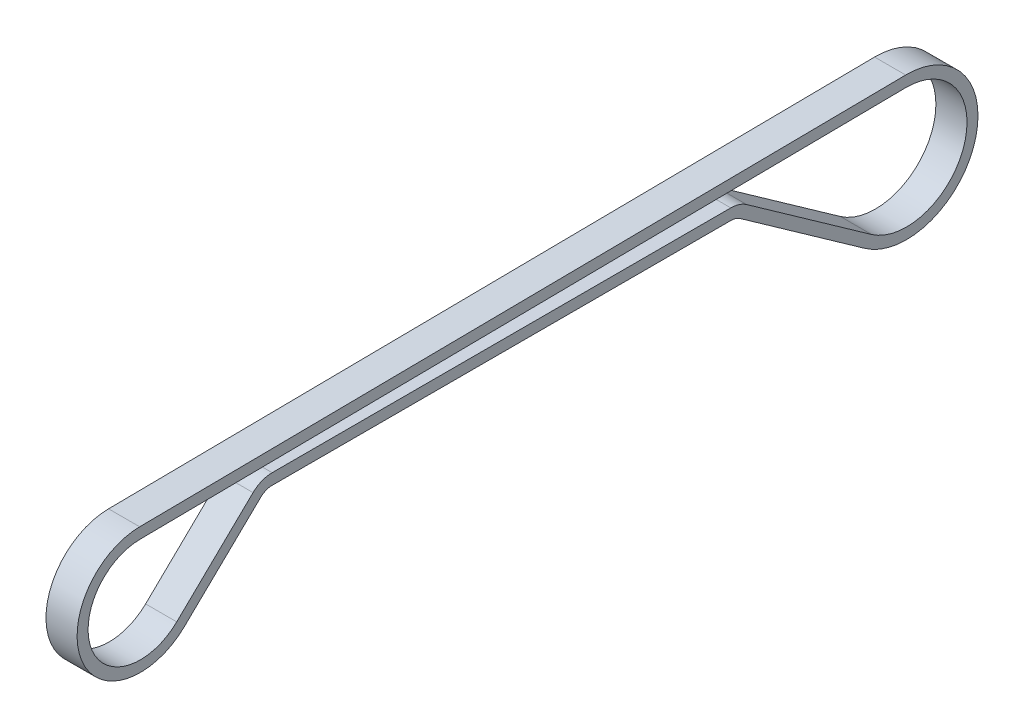
ISO-10303-21;
HEADER;
FILE_DESCRIPTION(('STEP AP214'),'2;1');
FILE_NAME('part.step','',(''),(''),'','','');
FILE_SCHEMA(('AUTOMOTIVE_DESIGN { 1 0 10303 214 1 1 1 1 }'));
ENDSEC;
DATA;
#1=APPLICATION_CONTEXT('core data for automotive mechanical design processes');
#2=APPLICATION_PROTOCOL_DEFINITION('international standard','automotive_design',2000,#1);
#3=PRODUCT_CONTEXT('',#1,'mechanical');
#4=PRODUCT('Part','Part','',(#3));
#5=PRODUCT_RELATED_PRODUCT_CATEGORY('part','',(#4));
#6=PRODUCT_DEFINITION_FORMATION('','',#4);
#7=PRODUCT_DEFINITION_CONTEXT('part definition',#1,'design');
#8=PRODUCT_DEFINITION('design','',#6,#7);
#9=PRODUCT_DEFINITION_SHAPE('','',#8);
#10=(LENGTH_UNIT() NAMED_UNIT(*) SI_UNIT(.MILLI.,.METRE.));
#11=(NAMED_UNIT(*) PLANE_ANGLE_UNIT() SI_UNIT($,.RADIAN.));
#12=(NAMED_UNIT(*) SI_UNIT($,.STERADIAN.) SOLID_ANGLE_UNIT());
#13=UNCERTAINTY_MEASURE_WITH_UNIT(LENGTH_MEASURE(1.E-05),#10,'distance_accuracy_value','');
#14=(GEOMETRIC_REPRESENTATION_CONTEXT(3) GLOBAL_UNCERTAINTY_ASSIGNED_CONTEXT((#13)) GLOBAL_UNIT_ASSIGNED_CONTEXT((#10,
#11,#12)) REPRESENTATION_CONTEXT('',''));
#15=CARTESIAN_POINT('',(0.,0.,0.));
#16=DIRECTION('',(0.,0.,1.));
#17=DIRECTION('',(1.,0.,0.));
#18=AXIS2_PLACEMENT_3D('',#15,#16,#17);
#19=CARTESIAN_POINT('',(15.7818,9.52500000000001,-221.533693244064));
#20=DIRECTION('',(0.,-1.,0.));
#21=DIRECTION('',(0.,0.,-1.));
#22=AXIS2_PLACEMENT_3D('',#19,#20,#21);
#23=PLANE('',#22);
#24=DIRECTION('',(0.,0.,1.));
#25=VECTOR('',#24,1.);
#26=CARTESIAN_POINT('',(6.78180000000002,9.52500000000001,-221.533693244064));
#27=LINE('',#26,#25);
#28=CARTESIAN_POINT('',(6.78180000000002,9.52500000000001,-170.733693244064));
#29=VERTEX_POINT('',#28);
#30=CARTESIAN_POINT('',(6.78180000000002,9.525,-38.1));
#31=VERTEX_POINT('',#30);
#32=EDGE_CURVE('E206',#29,#31,#27,.T.);
#33=ORIENTED_EDGE('',*,*,#32,.F.);
#34=DIRECTION('',(-1.,0.,0.));
#35=VECTOR('',#34,1.);
#36=CARTESIAN_POINT('',(15.7818,9.52500000000001,-170.733693244064));
#37=LINE('',#36,#35);
#38=CARTESIAN_POINT('',(15.7818,9.52500000000001,-170.733693244064));
#39=VERTEX_POINT('',#38);
#40=EDGE_CURVE('E11',#39,#29,#37,.T.);
#41=ORIENTED_EDGE('',*,*,#40,.F.);
#42=DIRECTION('',(0.,0.,1.));
#43=VECTOR('',#42,1.);
#44=CARTESIAN_POINT('',(15.7818,9.52500000000001,-221.533693244064));
#45=LINE('',#44,#43);
#46=CARTESIAN_POINT('',(15.7818,9.525,-38.1));
#47=VERTEX_POINT('',#46);
#48=EDGE_CURVE('E218',#39,#47,#45,.T.);
#49=ORIENTED_EDGE('',*,*,#48,.T.);
#50=DIRECTION('',(-1.,0.,0.));
#51=VECTOR('',#50,1.);
#52=CARTESIAN_POINT('',(15.7818,9.525,-38.1));
#53=LINE('',#52,#51);
#54=EDGE_CURVE('E40',#47,#31,#53,.T.);
#55=ORIENTED_EDGE('',*,*,#54,.T.);
#56=EDGE_LOOP('',(#33,#41,#49,#55));
#57=FACE_BOUND('',#56,.T.);
#58=ADVANCED_FACE('F37',(#57),#23,.T.);
#59=CARTESIAN_POINT('',(15.7818,4.7625,-170.733693244064));
#60=DIRECTION('',(-1.,0.,0.));
#61=DIRECTION('',(0.,0.,1.));
#62=AXIS2_PLACEMENT_3D('',#59,#60,#61);
#63=CYLINDRICAL_SURFACE('',#62,4.7625);
#64=CARTESIAN_POINT('',(6.78180000000002,4.7625,-170.733693244064));
#65=DIRECTION('',(1.,0.,0.));
#66=DIRECTION('',(0.,0.,-1.));
#67=AXIS2_PLACEMENT_3D('',#64,#65,#66);
#68=CIRCLE('',#67,4.7625);
#69=CARTESIAN_POINT('',(6.78180000000002,8.65054715658718,-173.484056048887));
#70=VERTEX_POINT('',#69);
#71=EDGE_CURVE('E222',#70,#29,#68,.T.);
#72=ORIENTED_EDGE('',*,*,#71,.F.);
#73=DIRECTION('',(-1.,0.,0.));
#74=VECTOR('',#73,1.);
#75=CARTESIAN_POINT('',(15.7818,8.65054715658718,-173.484056048887));
#76=LINE('',#75,#74);
#77=CARTESIAN_POINT('',(15.7818,8.65054715658718,-173.484056048887));
#78=VERTEX_POINT('',#77);
#79=EDGE_CURVE('E45',#78,#70,#76,.T.);
#80=ORIENTED_EDGE('',*,*,#79,.F.);
#81=CARTESIAN_POINT('',(15.7818,4.7625,-170.733693244064));
#82=DIRECTION('',(1.,0.,0.));
#83=DIRECTION('',(0.,0.,-1.));
#84=AXIS2_PLACEMENT_3D('',#81,#82,#83);
#85=CIRCLE('',#84,4.7625);
#86=EDGE_CURVE('E238',#78,#39,#85,.T.);
#87=ORIENTED_EDGE('',*,*,#86,.T.);
#88=ORIENTED_EDGE('',*,*,#40,.T.);
#89=EDGE_LOOP('',(#72,#80,#87,#88));
#90=FACE_BOUND('',#89,.T.);
#91=ADVANCED_FACE('F286',(#90),#63,.F.);
#92=CARTESIAN_POINT('',(15.7818,-16.8883347840239,-209.587066581708));
#93=DIRECTION('',(0.,-0.816387854401507,0.577504001012723));
#94=DIRECTION('',(0.,-0.577504001012723,-0.816387854401507));
#95=AXIS2_PLACEMENT_3D('',#92,#93,#94);
#96=PLANE('',#95);
#97=DIRECTION('',(0.,0.577504001012723,0.816387854401507));
#98=VECTOR('',#97,1.);
#99=CARTESIAN_POINT('',(6.78180000000002,-16.8883347840239,-209.587066581708));
#100=LINE('',#99,#98);
#101=CARTESIAN_POINT('',(6.78180000000002,-16.8883347840239,-209.587066581708));
#102=VERTEX_POINT('',#101);
#103=EDGE_CURVE('E258',#102,#70,#100,.T.);
#104=ORIENTED_EDGE('',*,*,#103,.F.);
#105=DIRECTION('',(-1.,0.,0.));
#106=VECTOR('',#105,1.);
#107=CARTESIAN_POINT('',(15.7818,-16.8883347840239,-209.587066581708));
#108=LINE('',#107,#106);
#109=CARTESIAN_POINT('',(15.7818,-16.8883347840239,-209.587066581708));
#110=VERTEX_POINT('',#109);
#111=EDGE_CURVE('E264',#110,#102,#108,.T.);
#112=ORIENTED_EDGE('',*,*,#111,.F.);
#113=DIRECTION('',(0.,0.577504001012723,0.816387854401507));
#114=VECTOR('',#113,1.);
#115=CARTESIAN_POINT('',(15.7818,-16.8883347840239,-209.587066581708));
#116=LINE('',#115,#114);
#117=EDGE_CURVE('E235',#110,#78,#116,.T.);
#118=ORIENTED_EDGE('',*,*,#117,.T.);
#119=ORIENTED_EDGE('',*,*,#79,.T.);
#120=EDGE_LOOP('',(#104,#112,#118,#119));
#121=FACE_BOUND('',#120,.T.);
#122=ADVANCED_FACE('F305',(#121),#96,.T.);
#123=CARTESIAN_POINT('',(15.7818,0.,-221.533693244064));
#124=DIRECTION('',(-1.,0.,0.));
#125=DIRECTION('',(0.,0.,1.));
#126=AXIS2_PLACEMENT_3D('',#123,#124,#125);
#127=CYLINDRICAL_SURFACE('',#126,20.6866560948592);
#128=CARTESIAN_POINT('',(6.78180000000002,0.,-221.533693244064));
#129=DIRECTION('',(1.,0.,0.));
#130=DIRECTION('',(0.,0.,-1.));
#131=AXIS2_PLACEMENT_3D('',#128,#129,#130);
#132=CIRCLE('',#131,20.6866560948592);
#133=CARTESIAN_POINT('',(6.78180000000002,20.68545482186,-221.310760070755));
#134=VERTEX_POINT('',#133);
#135=EDGE_CURVE('E255',#102,#134,#132,.T.);
#136=ORIENTED_EDGE('',*,*,#135,.T.);
#137=DIRECTION('',(-1.,0.,0.));
#138=VECTOR('',#137,1.);
#139=CARTESIAN_POINT('',(15.7818,20.68545482186,-221.310760070755));
#140=LINE('',#139,#138);
#141=CARTESIAN_POINT('',(15.7818,20.68545482186,-221.310760070755));
#142=VERTEX_POINT('',#141);
#143=EDGE_CURVE('E266',#142,#134,#140,.T.);
#144=ORIENTED_EDGE('',*,*,#143,.F.);
#145=CARTESIAN_POINT('',(15.7818,0.,-221.533693244064));
#146=DIRECTION('',(1.,0.,0.));
#147=DIRECTION('',(0.,0.,-1.));
#148=AXIS2_PLACEMENT_3D('',#145,#146,#147);
#149=CIRCLE('',#148,20.6866560948592);
#150=EDGE_CURVE('E233',#110,#142,#149,.T.);
#151=ORIENTED_EDGE('',*,*,#150,.F.);
#152=ORIENTED_EDGE('',*,*,#111,.T.);
#153=EDGE_LOOP('',(#136,#144,#151,#152));
#154=FACE_BOUND('',#153,.T.);
#155=ADVANCED_FACE('F303',(#154),#127,.T.);
#156=CARTESIAN_POINT('',(15.7818,20.68545482186,-221.310760070755));
#157=DIRECTION('',(0.,0.999941930054156,0.0107766655125783));
#158=DIRECTION('',(0.,-0.0107766655125783,0.999941930054156));
#159=AXIS2_PLACEMENT_3D('',#156,#157,#158);
#160=PLANE('',#159);
#161=DIRECTION('',(0.,0.0107766655125783,-0.999941930054156));
#162=VECTOR('',#161,1.);
#163=CARTESIAN_POINT('',(6.78180000000002,20.68545482186,-221.310760070755));
#164=LINE('',#163,#162);
#165=CARTESIAN_POINT('',(6.78180000000002,18.2981989458726,0.197205021207264));
#166=VERTEX_POINT('',#165);
#167=EDGE_CURVE('E252',#166,#134,#164,.T.);
#168=ORIENTED_EDGE('',*,*,#167,.F.);
#169=DIRECTION('',(-1.,0.,0.));
#170=VECTOR('',#169,1.);
#171=CARTESIAN_POINT('',(15.7818,18.2981989458726,0.197205021207264));
#172=LINE('',#171,#170);
#173=CARTESIAN_POINT('',(15.7818,18.2981989458726,0.197205021207264));
#174=VERTEX_POINT('',#173);
#175=EDGE_CURVE('E268',#174,#166,#172,.T.);
#176=ORIENTED_EDGE('',*,*,#175,.F.);
#177=DIRECTION('',(0.,0.0107766655125783,-0.999941930054156));
#178=VECTOR('',#177,1.);
#179=CARTESIAN_POINT('',(15.7818,20.68545482186,-221.310760070755));
#180=LINE('',#179,#178);
#181=EDGE_CURVE('E230',#174,#142,#180,.T.);
#182=ORIENTED_EDGE('',*,*,#181,.T.);
#183=ORIENTED_EDGE('',*,*,#143,.T.);
#184=EDGE_LOOP('',(#168,#176,#182,#183));
#185=FACE_BOUND('',#184,.T.);
#186=ADVANCED_FACE('F299',(#185),#160,.T.);
#187=CARTESIAN_POINT('',(15.7818,0.,0.));
#188=DIRECTION('',(-1.,0.,0.));
#189=DIRECTION('',(0.,0.,1.));
#190=AXIS2_PLACEMENT_3D('',#187,#188,#189);
#191=CYLINDRICAL_SURFACE('',#190,18.2992615830017);
#192=CARTESIAN_POINT('',(6.78180000000002,0.,0.));
#193=DIRECTION('',(1.,0.,0.));
#194=DIRECTION('',(0.,0.,-1.));
#195=AXIS2_PLACEMENT_3D('',#192,#193,#194);
#196=CIRCLE('',#195,18.2992615830017);
#197=CARTESIAN_POINT('',(6.78180000000002,-13.1546355280788,-12.720791587261));
#198=VERTEX_POINT('',#197);
#199=EDGE_CURVE('E249',#166,#198,#196,.T.);
#200=ORIENTED_EDGE('',*,*,#199,.T.);
#201=DIRECTION('',(-1.,0.,0.));
#202=VECTOR('',#201,1.);
#203=CARTESIAN_POINT('',(15.7818,-13.1546355280788,-12.720791587261));
#204=LINE('',#203,#202);
#205=CARTESIAN_POINT('',(15.7818,-13.1546355280788,-12.720791587261));
#206=VERTEX_POINT('',#205);
#207=EDGE_CURVE('E270',#206,#198,#204,.T.);
#208=ORIENTED_EDGE('',*,*,#207,.F.);
#209=CARTESIAN_POINT('',(15.7818,0.,0.));
#210=DIRECTION('',(1.,0.,0.));
#211=DIRECTION('',(0.,0.,-1.));
#212=AXIS2_PLACEMENT_3D('',#209,#210,#211);
#213=CIRCLE('',#212,18.2992615830017);
#214=EDGE_CURVE('E228',#174,#206,#213,.T.);
#215=ORIENTED_EDGE('',*,*,#214,.F.);
#216=ORIENTED_EDGE('',*,*,#175,.T.);
#217=EDGE_LOOP('',(#200,#208,#215,#216));
#218=FACE_BOUND('',#217,.T.);
#219=ADVANCED_FACE('F345',(#218),#191,.T.);
#220=CARTESIAN_POINT('',(15.7818,97.5499510053752,-127.200969738486));
#221=DIRECTION('',(0.,-0.718861549052787,-0.695153273237943));
#222=DIRECTION('',(0.,0.695153273237944,-0.718861549052788));
#223=AXIS2_PLACEMENT_3D('',#220,#221,#222);
#224=PLANE('',#223);
#225=DIRECTION('',(0.,-0.695153273237944,0.718861549052788));
#226=VECTOR('',#225,1.);
#227=CARTESIAN_POINT('',(6.78180000000002,97.5499510053752,-127.200969738486));
#228=LINE('',#227,#226);
#229=CARTESIAN_POINT('',(6.78180000000002,8.18607812736388,-34.7893325362043));
#230=VERTEX_POINT('',#229);
#231=EDGE_CURVE('E246',#230,#198,#228,.T.);
#232=ORIENTED_EDGE('',*,*,#231,.F.);
#233=DIRECTION('',(-1.,0.,0.));
#234=VECTOR('',#233,1.);
#235=CARTESIAN_POINT('',(15.7818,8.18607812736388,-34.7893325362043));
#236=LINE('',#235,#234);
#237=CARTESIAN_POINT('',(15.7818,8.18607812736388,-34.7893325362043));
#238=VERTEX_POINT('',#237);
#239=EDGE_CURVE('E271',#238,#230,#236,.T.);
#240=ORIENTED_EDGE('',*,*,#239,.F.);
#241=DIRECTION('',(0.,-0.695153273237944,0.718861549052788));
#242=VECTOR('',#241,1.);
#243=CARTESIAN_POINT('',(15.7818,97.5499510053752,-127.200969738486));
#244=LINE('',#243,#242);
#245=EDGE_CURVE('E225',#238,#206,#244,.T.);
#246=ORIENTED_EDGE('',*,*,#245,.T.);
#247=ORIENTED_EDGE('',*,*,#207,.T.);
#248=EDGE_LOOP('',(#232,#240,#246,#247));
#249=FACE_BOUND('',#248,.T.);
#250=ADVANCED_FACE('F294',(#249),#224,.T.);
#251=CARTESIAN_POINT('',(15.7818,4.7625,-38.1));
#252=DIRECTION('',(-1.,0.,0.));
#253=DIRECTION('',(0.,0.,1.));
#254=AXIS2_PLACEMENT_3D('',#251,#252,#253);
#255=CYLINDRICAL_SURFACE('',#254,4.7625);
#256=CARTESIAN_POINT('',(6.78180000000002,4.7625,-38.1));
#257=DIRECTION('',(1.,0.,0.));
#258=DIRECTION('',(0.,0.,-1.));
#259=AXIS2_PLACEMENT_3D('',#256,#257,#258);
#260=CIRCLE('',#259,4.7625);
#261=EDGE_CURVE('E243',#31,#230,#260,.T.);
#262=ORIENTED_EDGE('',*,*,#261,.F.);
#263=ORIENTED_EDGE('',*,*,#54,.F.);
#264=CARTESIAN_POINT('',(15.7818,4.7625,-38.1));
#265=DIRECTION('',(1.,0.,0.));
#266=DIRECTION('',(0.,0.,-1.));
#267=AXIS2_PLACEMENT_3D('',#264,#265,#266);
#268=CIRCLE('',#267,4.7625);
#269=EDGE_CURVE('E221',#47,#238,#268,.T.);
#270=ORIENTED_EDGE('',*,*,#269,.T.);
#271=ORIENTED_EDGE('',*,*,#239,.T.);
#272=EDGE_LOOP('',(#262,#263,#270,#271));
#273=FACE_BOUND('',#272,.T.);
#274=ADVANCED_FACE('F279',(#273),#255,.F.);
#275=CARTESIAN_POINT('',(15.7818,4.7625,-38.1));
#276=DIRECTION('',(1.,0.,0.));
#277=DIRECTION('',(0.,0.,-1.));
#278=AXIS2_PLACEMENT_3D('',#275,#276,#277);
#279=PLANE('',#278);
#280=DIRECTION('',(0.,0.,1.));
#281=VECTOR('',#280,1.);
#282=CARTESIAN_POINT('',(15.7818,12.7,-221.533693244064));
#283=LINE('',#282,#281);
#284=CARTESIAN_POINT('',(15.7818,12.7,-170.733693244064));
#285=VERTEX_POINT('',#284);
#286=CARTESIAN_POINT('',(15.7818,12.7,-38.1));
#287=VERTEX_POINT('',#286);
#288=EDGE_CURVE('E153',#285,#287,#283,.T.);
#289=ORIENTED_EDGE('',*,*,#288,.T.);
#290=CARTESIAN_POINT('',(15.7818,4.7625,-38.1));
#291=DIRECTION('',(1.,0.,0.));
#292=DIRECTION('',(0.,0.,-1.));
#293=AXIS2_PLACEMENT_3D('',#290,#291,#292);
#294=CIRCLE('',#293,7.9375);
#295=CARTESIAN_POINT('',(15.7818,10.4684635456065,-32.5822208936738));
#296=VERTEX_POINT('',#295);
#297=EDGE_CURVE('E162',#287,#296,#294,.T.);
#298=ORIENTED_EDGE('',*,*,#297,.T.);
#299=DIRECTION('',(0.,-0.695153273237944,0.718861549052787));
#300=VECTOR('',#299,1.);
#301=CARTESIAN_POINT('',(15.7818,99.8323364236178,-124.993858095956));
#302=LINE('',#301,#300);
#303=CARTESIAN_POINT('',(15.7818,-10.8722501098362,-10.5136799447306));
#304=VERTEX_POINT('',#303);
#305=EDGE_CURVE('E53',#296,#304,#302,.T.);
#306=ORIENTED_EDGE('',*,*,#305,.T.);
#307=CARTESIAN_POINT('',(15.7818,0.,0.));
#308=DIRECTION('',(1.,0.,0.));
#309=DIRECTION('',(0.,0.,-1.));
#310=AXIS2_PLACEMENT_3D('',#307,#308,#309);
#311=CIRCLE('',#310,15.1242615830017);
#312=CARTESIAN_POINT('',(15.7818,15.1233833179507,0.162989108204836));
#313=VERTEX_POINT('',#312);
#314=EDGE_CURVE('E177',#313,#304,#311,.T.);
#315=ORIENTED_EDGE('',*,*,#314,.F.);
#316=DIRECTION('',(0.,0.0107766655125783,-0.999941930054156));
#317=VECTOR('',#316,1.);
#318=CARTESIAN_POINT('',(15.7818,17.5106391939381,-221.344975983758));
#319=LINE('',#318,#317);
#320=CARTESIAN_POINT('',(15.7818,17.5106391939381,-221.344975983758));
#321=VERTEX_POINT('',#320);
#322=EDGE_CURVE('E179',#313,#321,#319,.T.);
#323=ORIENTED_EDGE('',*,*,#322,.T.);
#324=CARTESIAN_POINT('',(15.7818,0.,-221.533693244064));
#325=DIRECTION('',(1.,0.,0.));
#326=DIRECTION('',(0.,0.,-1.));
#327=AXIS2_PLACEMENT_3D('',#324,#325,#326);
#328=CIRCLE('',#327,17.5116560948591);
#329=CARTESIAN_POINT('',(15.7818,-14.2963033462991,-211.420641784924));
#330=VERTEX_POINT('',#329);
#331=EDGE_CURVE('E182',#330,#321,#328,.T.);
#332=ORIENTED_EDGE('',*,*,#331,.F.);
#333=DIRECTION('',(0.,0.577504001012723,0.816387854401507));
#334=VECTOR('',#333,1.);
#335=CARTESIAN_POINT('',(15.7818,-14.2963033462991,-211.420641784924));
#336=LINE('',#335,#334);
#337=CARTESIAN_POINT('',(15.7818,11.242578594312,-175.317631252102));
#338=VERTEX_POINT('',#337);
#339=EDGE_CURVE('E184',#330,#338,#336,.T.);
#340=ORIENTED_EDGE('',*,*,#339,.T.);
#341=CARTESIAN_POINT('',(15.7818,4.7625,-170.733693244064));
#342=DIRECTION('',(1.,0.,0.));
#343=DIRECTION('',(0.,0.,-1.));
#344=AXIS2_PLACEMENT_3D('',#341,#342,#343);
#345=CIRCLE('',#344,7.93750000000001);
#346=EDGE_CURVE('E159',#338,#285,#345,.T.);
#347=ORIENTED_EDGE('',*,*,#346,.T.);
#348=EDGE_LOOP('',(#289,#298,#306,#315,#323,#332,#340,#347));
#349=FACE_BOUND('',#348,.T.);
#350=ORIENTED_EDGE('',*,*,#48,.F.);
#351=ORIENTED_EDGE('',*,*,#86,.F.);
#352=ORIENTED_EDGE('',*,*,#117,.F.);
#353=ORIENTED_EDGE('',*,*,#150,.T.);
#354=ORIENTED_EDGE('',*,*,#181,.F.);
#355=ORIENTED_EDGE('',*,*,#214,.T.);
#356=ORIENTED_EDGE('',*,*,#245,.F.);
#357=ORIENTED_EDGE('',*,*,#269,.F.);
#358=EDGE_LOOP('',(#350,#351,#352,#353,#354,#355,#356,#357));
#359=FACE_BOUND('',#358,.T.);
#360=ADVANCED_FACE('F166',(#349,#359),#279,.T.);
#361=CARTESIAN_POINT('',(6.78180000000002,4.7625,-38.1));
#362=DIRECTION('',(1.,0.,0.));
#363=DIRECTION('',(0.,0.,-1.));
#364=AXIS2_PLACEMENT_3D('',#361,#362,#363);
#365=PLANE('',#364);
#366=CARTESIAN_POINT('',(6.78180000000002,4.7625,-38.1));
#367=DIRECTION('',(1.,0.,0.));
#368=DIRECTION('',(0.,0.,-1.));
#369=AXIS2_PLACEMENT_3D('',#366,#367,#368);
#370=CIRCLE('',#369,7.9375);
#371=CARTESIAN_POINT('',(6.78180000000002,12.7,-38.1));
#372=VERTEX_POINT('',#371);
#373=CARTESIAN_POINT('',(6.78180000000002,10.4684635456065,-32.5822208936738));
#374=VERTEX_POINT('',#373);
#375=EDGE_CURVE('E188',#372,#374,#370,.T.);
#376=ORIENTED_EDGE('',*,*,#375,.F.);
#377=DIRECTION('',(0.,0.,1.));
#378=VECTOR('',#377,1.);
#379=CARTESIAN_POINT('',(6.78180000000002,12.7,-221.533693244064));
#380=LINE('',#379,#378);
#381=CARTESIAN_POINT('',(6.78180000000002,12.7,-170.733693244064));
#382=VERTEX_POINT('',#381);
#383=EDGE_CURVE('E61',#382,#372,#380,.T.);
#384=ORIENTED_EDGE('',*,*,#383,.F.);
#385=CARTESIAN_POINT('',(6.78180000000002,4.7625,-170.733693244064));
#386=DIRECTION('',(1.,0.,0.));
#387=DIRECTION('',(0.,0.,-1.));
#388=AXIS2_PLACEMENT_3D('',#385,#386,#387);
#389=CIRCLE('',#388,7.93750000000001);
#390=CARTESIAN_POINT('',(6.78180000000002,11.242578594312,-175.317631252102));
#391=VERTEX_POINT('',#390);
#392=EDGE_CURVE('E170',#391,#382,#389,.T.);
#393=ORIENTED_EDGE('',*,*,#392,.F.);
#394=DIRECTION('',(0.,0.577504001012723,0.816387854401507));
#395=VECTOR('',#394,1.);
#396=CARTESIAN_POINT('',(6.78180000000002,-14.2963033462991,-211.420641784924));
#397=LINE('',#396,#395);
#398=CARTESIAN_POINT('',(6.78180000000002,-14.2963033462991,-211.420641784924));
#399=VERTEX_POINT('',#398);
#400=EDGE_CURVE('E173',#399,#391,#397,.T.);
#401=ORIENTED_EDGE('',*,*,#400,.F.);
#402=CARTESIAN_POINT('',(6.78180000000002,0.,-221.533693244064));
#403=DIRECTION('',(1.,0.,0.));
#404=DIRECTION('',(0.,0.,-1.));
#405=AXIS2_PLACEMENT_3D('',#402,#403,#404);
#406=CIRCLE('',#405,17.5116560948591);
#407=CARTESIAN_POINT('',(6.78180000000002,17.5106391939381,-221.344975983758));
#408=VERTEX_POINT('',#407);
#409=EDGE_CURVE('E199',#399,#408,#406,.T.);
#410=ORIENTED_EDGE('',*,*,#409,.T.);
#411=DIRECTION('',(0.,0.0107766655125783,-0.999941930054156));
#412=VECTOR('',#411,1.);
#413=CARTESIAN_POINT('',(6.78180000000002,17.5106391939381,-221.344975983758));
#414=LINE('',#413,#412);
#415=CARTESIAN_POINT('',(6.78180000000002,15.1233833179507,0.162989108204836));
#416=VERTEX_POINT('',#415);
#417=EDGE_CURVE('E196',#416,#408,#414,.T.);
#418=ORIENTED_EDGE('',*,*,#417,.F.);
#419=CARTESIAN_POINT('',(6.78180000000002,0.,0.));
#420=DIRECTION('',(1.,0.,0.));
#421=DIRECTION('',(0.,0.,-1.));
#422=AXIS2_PLACEMENT_3D('',#419,#420,#421);
#423=CIRCLE('',#422,15.1242615830017);
#424=CARTESIAN_POINT('',(6.78180000000002,-10.8722501098362,-10.5136799447306));
#425=VERTEX_POINT('',#424);
#426=EDGE_CURVE('E193',#416,#425,#423,.T.);
#427=ORIENTED_EDGE('',*,*,#426,.T.);
#428=DIRECTION('',(0.,-0.695153273237944,0.718861549052787));
#429=VECTOR('',#428,1.);
#430=CARTESIAN_POINT('',(6.78180000000002,99.8323364236178,-124.993858095956));
#431=LINE('',#430,#429);
#432=EDGE_CURVE('E190',#374,#425,#431,.T.);
#433=ORIENTED_EDGE('',*,*,#432,.F.);
#434=EDGE_LOOP('',(#376,#384,#393,#401,#410,#418,#427,#433));
#435=FACE_BOUND('',#434,.T.);
#436=ORIENTED_EDGE('',*,*,#32,.T.);
#437=ORIENTED_EDGE('',*,*,#261,.T.);
#438=ORIENTED_EDGE('',*,*,#231,.T.);
#439=ORIENTED_EDGE('',*,*,#199,.F.);
#440=ORIENTED_EDGE('',*,*,#167,.T.);
#441=ORIENTED_EDGE('',*,*,#135,.F.);
#442=ORIENTED_EDGE('',*,*,#103,.T.);
#443=ORIENTED_EDGE('',*,*,#71,.T.);
#444=EDGE_LOOP('',(#436,#437,#438,#439,#440,#441,#442,#443));
#445=FACE_BOUND('',#444,.T.);
#446=ADVANCED_FACE('F281',(#435,#445),#365,.F.);
#447=CARTESIAN_POINT('',(15.7818,12.7,-221.533693244064));
#448=DIRECTION('',(0.,-1.,0.));
#449=DIRECTION('',(0.,0.,-1.));
#450=AXIS2_PLACEMENT_3D('',#447,#448,#449);
#451=PLANE('',#450);
#452=ORIENTED_EDGE('',*,*,#383,.T.);
#453=DIRECTION('',(-1.,0.,0.));
#454=VECTOR('',#453,1.);
#455=CARTESIAN_POINT('',(15.7818,12.7,-38.1));
#456=LINE('',#455,#454);
#457=EDGE_CURVE('E149',#287,#372,#456,.T.);
#458=ORIENTED_EDGE('',*,*,#457,.F.);
#459=ORIENTED_EDGE('',*,*,#288,.F.);
#460=DIRECTION('',(-1.,0.,0.));
#461=VECTOR('',#460,1.);
#462=CARTESIAN_POINT('',(15.7818,12.7,-170.733693244064));
#463=LINE('',#462,#461);
#464=EDGE_CURVE('E204',#285,#382,#463,.T.);
#465=ORIENTED_EDGE('',*,*,#464,.T.);
#466=EDGE_LOOP('',(#452,#458,#459,#465));
#467=FACE_BOUND('',#466,.T.);
#468=ADVANCED_FACE('F151',(#467),#451,.F.);
#469=CARTESIAN_POINT('',(15.7818,4.7625,-170.733693244064));
#470=DIRECTION('',(-1.,0.,0.));
#471=DIRECTION('',(0.,0.,1.));
#472=AXIS2_PLACEMENT_3D('',#469,#470,#471);
#473=CYLINDRICAL_SURFACE('',#472,7.93750000000001);
#474=ORIENTED_EDGE('',*,*,#392,.T.);
#475=ORIENTED_EDGE('',*,*,#464,.F.);
#476=ORIENTED_EDGE('',*,*,#346,.F.);
#477=DIRECTION('',(-1.,0.,0.));
#478=VECTOR('',#477,1.);
#479=CARTESIAN_POINT('',(15.7818,11.242578594312,-175.317631252102));
#480=LINE('',#479,#478);
#481=EDGE_CURVE('E207',#338,#391,#480,.T.);
#482=ORIENTED_EDGE('',*,*,#481,.T.);
#483=EDGE_LOOP('',(#474,#475,#476,#482));
#484=FACE_BOUND('',#483,.T.);
#485=ADVANCED_FACE('F400',(#484),#473,.T.);
#486=CARTESIAN_POINT('',(15.7818,-14.2963033462991,-211.420641784924));
#487=DIRECTION('',(0.,-0.816387854401507,0.577504001012723));
#488=DIRECTION('',(0.,-0.577504001012723,-0.816387854401508));
#489=AXIS2_PLACEMENT_3D('',#486,#487,#488);
#490=PLANE('',#489);
#491=ORIENTED_EDGE('',*,*,#400,.T.);
#492=ORIENTED_EDGE('',*,*,#481,.F.);
#493=ORIENTED_EDGE('',*,*,#339,.F.);
#494=DIRECTION('',(-1.,0.,0.));
#495=VECTOR('',#494,1.);
#496=CARTESIAN_POINT('',(15.7818,-14.2963033462991,-211.420641784924));
#497=LINE('',#496,#495);
#498=EDGE_CURVE('E209',#330,#399,#497,.T.);
#499=ORIENTED_EDGE('',*,*,#498,.T.);
#500=EDGE_LOOP('',(#491,#492,#493,#499));
#501=FACE_BOUND('',#500,.T.);
#502=ADVANCED_FACE('F410',(#501),#490,.F.);
#503=CARTESIAN_POINT('',(15.7818,0.,-221.533693244064));
#504=DIRECTION('',(-1.,0.,0.));
#505=DIRECTION('',(0.,0.,1.));
#506=AXIS2_PLACEMENT_3D('',#503,#504,#505);
#507=CYLINDRICAL_SURFACE('',#506,17.5116560948591);
#508=ORIENTED_EDGE('',*,*,#409,.F.);
#509=ORIENTED_EDGE('',*,*,#498,.F.);
#510=ORIENTED_EDGE('',*,*,#331,.T.);
#511=DIRECTION('',(-1.,0.,0.));
#512=VECTOR('',#511,1.);
#513=CARTESIAN_POINT('',(15.7818,17.5106391939381,-221.344975983758));
#514=LINE('',#513,#512);
#515=EDGE_CURVE('E211',#321,#408,#514,.T.);
#516=ORIENTED_EDGE('',*,*,#515,.T.);
#517=EDGE_LOOP('',(#508,#509,#510,#516));
#518=FACE_BOUND('',#517,.T.);
#519=ADVANCED_FACE('F421',(#518),#507,.F.);
#520=CARTESIAN_POINT('',(15.7818,17.5106391939381,-221.344975983758));
#521=DIRECTION('',(0.,0.999941930054156,0.0107766655125783));
#522=DIRECTION('',(0.,-0.0107766655125783,0.999941930054156));
#523=AXIS2_PLACEMENT_3D('',#520,#521,#522);
#524=PLANE('',#523);
#525=ORIENTED_EDGE('',*,*,#417,.T.);
#526=ORIENTED_EDGE('',*,*,#515,.F.);
#527=ORIENTED_EDGE('',*,*,#322,.F.);
#528=DIRECTION('',(-1.,0.,0.));
#529=VECTOR('',#528,1.);
#530=CARTESIAN_POINT('',(15.7818,15.1233833179507,0.162989108204836));
#531=LINE('',#530,#529);
#532=EDGE_CURVE('E213',#313,#416,#531,.T.);
#533=ORIENTED_EDGE('',*,*,#532,.T.);
#534=EDGE_LOOP('',(#525,#526,#527,#533));
#535=FACE_BOUND('',#534,.T.);
#536=ADVANCED_FACE('F432',(#535),#524,.F.);
#537=CARTESIAN_POINT('',(15.7818,0.,0.));
#538=DIRECTION('',(-1.,0.,0.));
#539=DIRECTION('',(0.,0.,1.));
#540=AXIS2_PLACEMENT_3D('',#537,#538,#539);
#541=CYLINDRICAL_SURFACE('',#540,15.1242615830017);
#542=ORIENTED_EDGE('',*,*,#426,.F.);
#543=ORIENTED_EDGE('',*,*,#532,.F.);
#544=ORIENTED_EDGE('',*,*,#314,.T.);
#545=DIRECTION('',(-1.,0.,0.));
#546=VECTOR('',#545,1.);
#547=CARTESIAN_POINT('',(15.7818,-10.8722501098362,-10.5136799447306));
#548=LINE('',#547,#546);
#549=EDGE_CURVE('E215',#304,#425,#548,.T.);
#550=ORIENTED_EDGE('',*,*,#549,.T.);
#551=EDGE_LOOP('',(#542,#543,#544,#550));
#552=FACE_BOUND('',#551,.T.);
#553=ADVANCED_FACE('F443',(#552),#541,.F.);
#554=CARTESIAN_POINT('',(15.7818,99.8323364236178,-124.993858095956));
#555=DIRECTION('',(0.,-0.718861549052787,-0.695153273237943));
#556=DIRECTION('',(0.,0.695153273237944,-0.718861549052788));
#557=AXIS2_PLACEMENT_3D('',#554,#555,#556);
#558=PLANE('',#557);
#559=ORIENTED_EDGE('',*,*,#432,.T.);
#560=ORIENTED_EDGE('',*,*,#549,.F.);
#561=ORIENTED_EDGE('',*,*,#305,.F.);
#562=DIRECTION('',(-1.,0.,0.));
#563=VECTOR('',#562,1.);
#564=CARTESIAN_POINT('',(15.7818,10.4684635456065,-32.5822208936738));
#565=LINE('',#564,#563);
#566=EDGE_CURVE('E158',#296,#374,#565,.T.);
#567=ORIENTED_EDGE('',*,*,#566,.T.);
#568=EDGE_LOOP('',(#559,#560,#561,#567));
#569=FACE_BOUND('',#568,.T.);
#570=ADVANCED_FACE('F454',(#569),#558,.F.);
#571=CARTESIAN_POINT('',(15.7818,4.7625,-38.1));
#572=DIRECTION('',(-1.,0.,0.));
#573=DIRECTION('',(0.,0.,1.));
#574=AXIS2_PLACEMENT_3D('',#571,#572,#573);
#575=CYLINDRICAL_SURFACE('',#574,7.9375);
#576=ORIENTED_EDGE('',*,*,#375,.T.);
#577=ORIENTED_EDGE('',*,*,#566,.F.);
#578=ORIENTED_EDGE('',*,*,#297,.F.);
#579=ORIENTED_EDGE('',*,*,#457,.T.);
#580=EDGE_LOOP('',(#576,#577,#578,#579));
#581=FACE_BOUND('',#580,.T.);
#582=ADVANCED_FACE('F163',(#581),#575,.T.);
#583=CLOSED_SHELL('',(#58,#91,#122,#155,#186,#219,#250,#274,#360,#446,#468,#485,#502,#519,#536,
#553,#570,#582));
#584=MANIFOLD_SOLID_BREP('B2',#583);
#585=ADVANCED_BREP_SHAPE_REPRESENTATION('',(#18,#584),#14);
#586=SHAPE_DEFINITION_REPRESENTATION(#9,#585);
ENDSEC;
END-ISO-10303-21;
